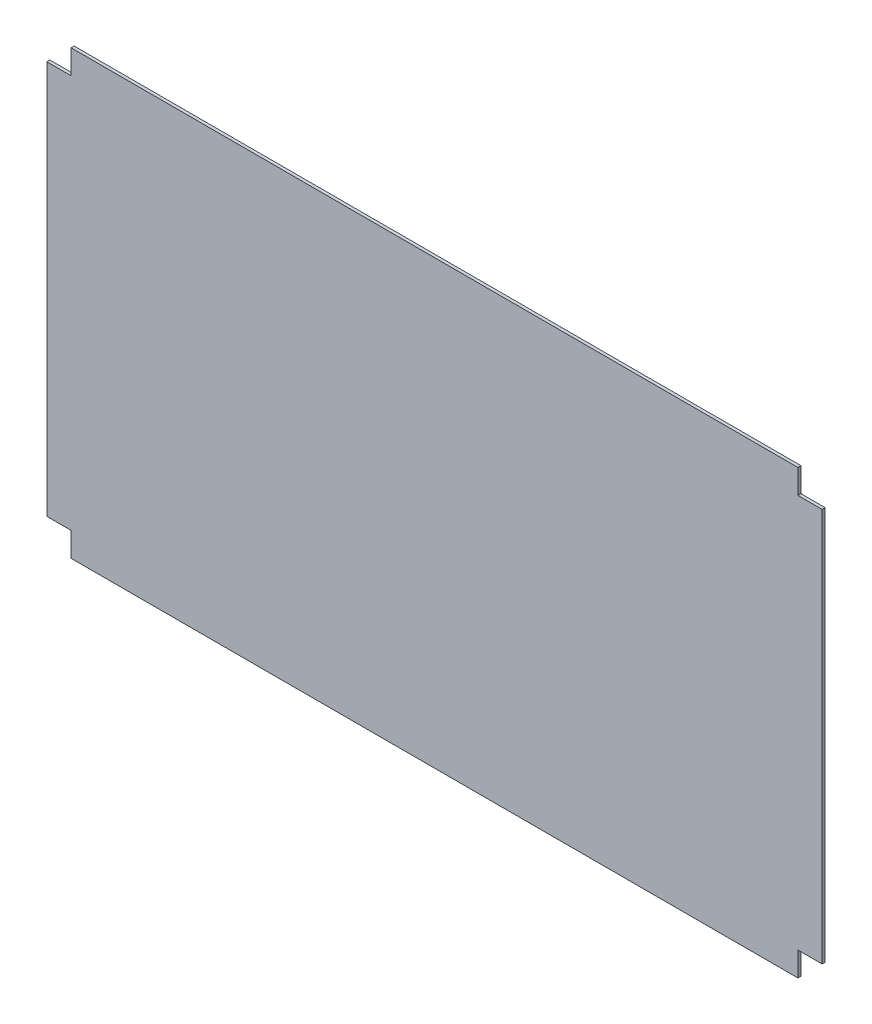
ISO-10303-21;
HEADER;
FILE_DESCRIPTION(('STEP AP214'),'2;1');
FILE_NAME('part.step','',(''),(''),'','','');
FILE_SCHEMA(('AUTOMOTIVE_DESIGN { 1 0 10303 214 1 1 1 1 }'));
ENDSEC;
DATA;
#1=APPLICATION_CONTEXT('core data for automotive mechanical design processes');
#2=APPLICATION_PROTOCOL_DEFINITION('international standard','automotive_design',2000,#1);
#3=PRODUCT_CONTEXT('',#1,'mechanical');
#4=PRODUCT('Part','Part','',(#3));
#5=PRODUCT_RELATED_PRODUCT_CATEGORY('part','',(#4));
#6=PRODUCT_DEFINITION_FORMATION('','',#4);
#7=PRODUCT_DEFINITION_CONTEXT('part definition',#1,'design');
#8=PRODUCT_DEFINITION('design','',#6,#7);
#9=PRODUCT_DEFINITION_SHAPE('','',#8);
#10=(LENGTH_UNIT() NAMED_UNIT(*) SI_UNIT(.MILLI.,.METRE.));
#11=(NAMED_UNIT(*) PLANE_ANGLE_UNIT() SI_UNIT($,.RADIAN.));
#12=(NAMED_UNIT(*) SI_UNIT($,.STERADIAN.) SOLID_ANGLE_UNIT());
#13=UNCERTAINTY_MEASURE_WITH_UNIT(LENGTH_MEASURE(1.E-05),#10,'distance_accuracy_value','');
#14=(GEOMETRIC_REPRESENTATION_CONTEXT(3) GLOBAL_UNCERTAINTY_ASSIGNED_CONTEXT((#13)) GLOBAL_UNIT_ASSIGNED_CONTEXT((#10,
#11,#12)) REPRESENTATION_CONTEXT('',''));
#15=CARTESIAN_POINT('',(0.,0.,0.));
#16=DIRECTION('',(0.,0.,1.));
#17=DIRECTION('',(1.,0.,0.));
#18=AXIS2_PLACEMENT_3D('',#15,#16,#17);
#19=CARTESIAN_POINT('',(40.0000000000001,0.,5.));
#20=DIRECTION('',(-1.,0.,0.));
#21=DIRECTION('',(0.,0.,1.));
#22=AXIS2_PLACEMENT_3D('',#19,#20,#21);
#23=PLANE('',#22);
#24=DIRECTION('',(0.,1.,0.));
#25=VECTOR('',#24,1.);
#26=CARTESIAN_POINT('',(40.0000000000001,0.,0.));
#27=LINE('',#26,#25);
#28=CARTESIAN_POINT('',(40.0000000000001,-730.,0.));
#29=VERTEX_POINT('',#28);
#30=CARTESIAN_POINT('',(40.0000000000001,-690.,0.));
#31=VERTEX_POINT('',#30);
#32=EDGE_CURVE('E154',#29,#31,#27,.T.);
#33=ORIENTED_EDGE('',*,*,#32,.F.);
#34=DIRECTION('',(0.,0.,-1.));
#35=VECTOR('',#34,1.);
#36=CARTESIAN_POINT('',(40.0000000000001,-730.,5.));
#37=LINE('',#36,#35);
#38=CARTESIAN_POINT('',(40.0000000000001,-730.,5.));
#39=VERTEX_POINT('',#38);
#40=EDGE_CURVE('E11',#39,#29,#37,.T.);
#41=ORIENTED_EDGE('',*,*,#40,.F.);
#42=DIRECTION('',(0.,1.,0.));
#43=VECTOR('',#42,1.);
#44=CARTESIAN_POINT('',(40.0000000000001,0.,5.));
#45=LINE('',#44,#43);
#46=CARTESIAN_POINT('',(40.0000000000001,-690.,5.));
#47=VERTEX_POINT('',#46);
#48=EDGE_CURVE('E184',#39,#47,#45,.T.);
#49=ORIENTED_EDGE('',*,*,#48,.T.);
#50=DIRECTION('',(0.,0.,-1.));
#51=VECTOR('',#50,1.);
#52=CARTESIAN_POINT('',(40.0000000000001,-690.,5.));
#53=LINE('',#52,#51);
#54=EDGE_CURVE('E97',#47,#31,#53,.T.);
#55=ORIENTED_EDGE('',*,*,#54,.T.);
#56=EDGE_LOOP('',(#33,#41,#49,#55));
#57=FACE_BOUND('',#56,.T.);
#58=ADVANCED_FACE('F35',(#57),#23,.T.);
#59=CARTESIAN_POINT('',(0.,-730.,5.));
#60=DIRECTION('',(0.,1.,0.));
#61=DIRECTION('',(0.,0.,1.));
#62=AXIS2_PLACEMENT_3D('',#59,#60,#61);
#63=PLANE('',#62);
#64=DIRECTION('',(1.,0.,0.));
#65=VECTOR('',#64,1.);
#66=CARTESIAN_POINT('',(0.,-730.,0.));
#67=LINE('',#66,#65);
#68=CARTESIAN_POINT('',(1240.,-730.,0.));
#69=VERTEX_POINT('',#68);
#70=EDGE_CURVE('E157',#29,#69,#67,.T.);
#71=ORIENTED_EDGE('',*,*,#70,.T.);
#72=DIRECTION('',(0.,0.,-1.));
#73=VECTOR('',#72,1.);
#74=CARTESIAN_POINT('',(1240.,-730.,5.));
#75=LINE('',#74,#73);
#76=CARTESIAN_POINT('',(1240.,-730.,5.));
#77=VERTEX_POINT('',#76);
#78=EDGE_CURVE('E43',#77,#69,#75,.T.);
#79=ORIENTED_EDGE('',*,*,#78,.F.);
#80=DIRECTION('',(1.,0.,0.));
#81=VECTOR('',#80,1.);
#82=CARTESIAN_POINT('',(0.,-730.,5.));
#83=LINE('',#82,#81);
#84=EDGE_CURVE('E225',#39,#77,#83,.T.);
#85=ORIENTED_EDGE('',*,*,#84,.F.);
#86=ORIENTED_EDGE('',*,*,#40,.T.);
#87=EDGE_LOOP('',(#71,#79,#85,#86));
#88=FACE_BOUND('',#87,.T.);
#89=ADVANCED_FACE('F254',(#88),#63,.F.);
#90=CARTESIAN_POINT('',(1240.,0.,5.));
#91=DIRECTION('',(-1.,0.,0.));
#92=DIRECTION('',(0.,0.,1.));
#93=AXIS2_PLACEMENT_3D('',#90,#91,#92);
#94=PLANE('',#93);
#95=DIRECTION('',(0.,1.,0.));
#96=VECTOR('',#95,1.);
#97=CARTESIAN_POINT('',(1240.,0.,0.));
#98=LINE('',#97,#96);
#99=CARTESIAN_POINT('',(1240.,-690.,0.));
#100=VERTEX_POINT('',#99);
#101=EDGE_CURVE('E159',#69,#100,#98,.T.);
#102=ORIENTED_EDGE('',*,*,#101,.T.);
#103=DIRECTION('',(0.,0.,-1.));
#104=VECTOR('',#103,1.);
#105=CARTESIAN_POINT('',(1240.,-690.,5.));
#106=LINE('',#105,#104);
#107=CARTESIAN_POINT('',(1240.,-690.,5.));
#108=VERTEX_POINT('',#107);
#109=EDGE_CURVE('E198',#108,#100,#106,.T.);
#110=ORIENTED_EDGE('',*,*,#109,.F.);
#111=DIRECTION('',(0.,1.,0.));
#112=VECTOR('',#111,1.);
#113=CARTESIAN_POINT('',(1240.,0.,5.));
#114=LINE('',#113,#112);
#115=EDGE_CURVE('E206',#77,#108,#114,.T.);
#116=ORIENTED_EDGE('',*,*,#115,.F.);
#117=ORIENTED_EDGE('',*,*,#78,.T.);
#118=EDGE_LOOP('',(#102,#110,#116,#117));
#119=FACE_BOUND('',#118,.T.);
#120=ADVANCED_FACE('F204',(#119),#94,.F.);
#121=CARTESIAN_POINT('',(0.,-690.,5.));
#122=DIRECTION('',(0.,-1.,0.));
#123=DIRECTION('',(0.,0.,-1.));
#124=AXIS2_PLACEMENT_3D('',#121,#122,#123);
#125=PLANE('',#124);
#126=DIRECTION('',(-1.,0.,0.));
#127=VECTOR('',#126,1.);
#128=CARTESIAN_POINT('',(0.,-690.,0.));
#129=LINE('',#128,#127);
#130=CARTESIAN_POINT('',(1280.,-690.,0.));
#131=VERTEX_POINT('',#130);
#132=EDGE_CURVE('E162',#131,#100,#129,.T.);
#133=ORIENTED_EDGE('',*,*,#132,.F.);
#134=DIRECTION('',(0.,0.,-1.));
#135=VECTOR('',#134,1.);
#136=CARTESIAN_POINT('',(1280.,-690.,5.));
#137=LINE('',#136,#135);
#138=CARTESIAN_POINT('',(1280.,-690.,5.));
#139=VERTEX_POINT('',#138);
#140=EDGE_CURVE('E196',#139,#131,#137,.T.);
#141=ORIENTED_EDGE('',*,*,#140,.F.);
#142=DIRECTION('',(-1.,0.,0.));
#143=VECTOR('',#142,1.);
#144=CARTESIAN_POINT('',(0.,-690.,5.));
#145=LINE('',#144,#143);
#146=EDGE_CURVE('E218',#139,#108,#145,.T.);
#147=ORIENTED_EDGE('',*,*,#146,.T.);
#148=ORIENTED_EDGE('',*,*,#109,.T.);
#149=EDGE_LOOP('',(#133,#141,#147,#148));
#150=FACE_BOUND('',#149,.T.);
#151=ADVANCED_FACE('F215',(#150),#125,.T.);
#152=CARTESIAN_POINT('',(1280.,0.,5.));
#153=DIRECTION('',(1.,0.,0.));
#154=DIRECTION('',(0.,0.,-1.));
#155=AXIS2_PLACEMENT_3D('',#152,#153,#154);
#156=PLANE('',#155);
#157=DIRECTION('',(0.,-1.,0.));
#158=VECTOR('',#157,1.);
#159=CARTESIAN_POINT('',(1280.,0.,0.));
#160=LINE('',#159,#158);
#161=CARTESIAN_POINT('',(1280.,-40.,0.));
#162=VERTEX_POINT('',#161);
#163=EDGE_CURVE('E165',#162,#131,#160,.T.);
#164=ORIENTED_EDGE('',*,*,#163,.F.);
#165=DIRECTION('',(0.,0.,-1.));
#166=VECTOR('',#165,1.);
#167=CARTESIAN_POINT('',(1280.,-40.,5.));
#168=LINE('',#167,#166);
#169=CARTESIAN_POINT('',(1280.,-40.,5.));
#170=VERTEX_POINT('',#169);
#171=EDGE_CURVE('E194',#170,#162,#168,.T.);
#172=ORIENTED_EDGE('',*,*,#171,.F.);
#173=DIRECTION('',(0.,-1.,0.));
#174=VECTOR('',#173,1.);
#175=CARTESIAN_POINT('',(1280.,0.,5.));
#176=LINE('',#175,#174);
#177=EDGE_CURVE('E221',#170,#139,#176,.T.);
#178=ORIENTED_EDGE('',*,*,#177,.T.);
#179=ORIENTED_EDGE('',*,*,#140,.T.);
#180=EDGE_LOOP('',(#164,#172,#178,#179));
#181=FACE_BOUND('',#180,.T.);
#182=ADVANCED_FACE('F322',(#181),#156,.T.);
#183=CARTESIAN_POINT('',(0.,-40.0000000000002,5.));
#184=DIRECTION('',(0.,-1.,0.));
#185=DIRECTION('',(1.,0.,0.));
#186=AXIS2_PLACEMENT_3D('',#183,#184,#185);
#187=PLANE('',#186);
#188=DIRECTION('',(-1.,0.,0.));
#189=VECTOR('',#188,1.);
#190=CARTESIAN_POINT('',(0.,-40.0000000000002,0.));
#191=LINE('',#190,#189);
#192=CARTESIAN_POINT('',(1240.,-40.,0.));
#193=VERTEX_POINT('',#192);
#194=EDGE_CURVE('E168',#162,#193,#191,.T.);
#195=ORIENTED_EDGE('',*,*,#194,.T.);
#196=DIRECTION('',(0.,0.,-1.));
#197=VECTOR('',#196,1.);
#198=CARTESIAN_POINT('',(1240.,-40.,5.));
#199=LINE('',#198,#197);
#200=CARTESIAN_POINT('',(1240.,-40.,5.));
#201=VERTEX_POINT('',#200);
#202=EDGE_CURVE('E192',#201,#193,#199,.T.);
#203=ORIENTED_EDGE('',*,*,#202,.F.);
#204=DIRECTION('',(-1.,0.,0.));
#205=VECTOR('',#204,1.);
#206=CARTESIAN_POINT('',(0.,-40.0000000000002,5.));
#207=LINE('',#206,#205);
#208=EDGE_CURVE('E223',#170,#201,#207,.T.);
#209=ORIENTED_EDGE('',*,*,#208,.F.);
#210=ORIENTED_EDGE('',*,*,#171,.T.);
#211=EDGE_LOOP('',(#195,#203,#209,#210));
#212=FACE_BOUND('',#211,.T.);
#213=ADVANCED_FACE('F313',(#212),#187,.F.);
#214=CARTESIAN_POINT('',(1240.,0.,5.));
#215=DIRECTION('',(1.,0.,0.));
#216=DIRECTION('',(0.,0.,-1.));
#217=AXIS2_PLACEMENT_3D('',#214,#215,#216);
#218=PLANE('',#217);
#219=DIRECTION('',(0.,-1.,0.));
#220=VECTOR('',#219,1.);
#221=CARTESIAN_POINT('',(1240.,0.,0.));
#222=LINE('',#221,#220);
#223=CARTESIAN_POINT('',(1240.,1.3433771062804E-13,0.));
#224=VERTEX_POINT('',#223);
#225=EDGE_CURVE('E171',#224,#193,#222,.T.);
#226=ORIENTED_EDGE('',*,*,#225,.F.);
#227=DIRECTION('',(0.,0.,-1.));
#228=VECTOR('',#227,1.);
#229=CARTESIAN_POINT('',(1240.,1.3433771062804E-13,5.));
#230=LINE('',#229,#228);
#231=CARTESIAN_POINT('',(1240.,1.3433771062804E-13,5.));
#232=VERTEX_POINT('',#231);
#233=EDGE_CURVE('E190',#232,#224,#230,.T.);
#234=ORIENTED_EDGE('',*,*,#233,.F.);
#235=DIRECTION('',(0.,-1.,0.));
#236=VECTOR('',#235,1.);
#237=CARTESIAN_POINT('',(1240.,0.,5.));
#238=LINE('',#237,#236);
#239=EDGE_CURVE('E230',#232,#201,#238,.T.);
#240=ORIENTED_EDGE('',*,*,#239,.T.);
#241=ORIENTED_EDGE('',*,*,#202,.T.);
#242=EDGE_LOOP('',(#226,#234,#240,#241));
#243=FACE_BOUND('',#242,.T.);
#244=ADVANCED_FACE('F241',(#243),#218,.T.);
#245=CARTESIAN_POINT('',(0.,0.,5.));
#246=DIRECTION('',(0.,1.,0.));
#247=DIRECTION('',(-1.,0.,0.));
#248=AXIS2_PLACEMENT_3D('',#245,#246,#247);
#249=PLANE('',#248);
#250=DIRECTION('',(1.,0.,0.));
#251=VECTOR('',#250,1.);
#252=CARTESIAN_POINT('',(0.,0.,0.));
#253=LINE('',#252,#251);
#254=CARTESIAN_POINT('',(40.,0.,0.));
#255=VERTEX_POINT('',#254);
#256=EDGE_CURVE('E174',#255,#224,#253,.T.);
#257=ORIENTED_EDGE('',*,*,#256,.F.);
#258=DIRECTION('',(0.,0.,-1.));
#259=VECTOR('',#258,1.);
#260=CARTESIAN_POINT('',(40.,0.,5.));
#261=LINE('',#260,#259);
#262=CARTESIAN_POINT('',(40.,0.,5.));
#263=VERTEX_POINT('',#262);
#264=EDGE_CURVE('E188',#263,#255,#261,.T.);
#265=ORIENTED_EDGE('',*,*,#264,.F.);
#266=DIRECTION('',(1.,0.,0.));
#267=VECTOR('',#266,1.);
#268=CARTESIAN_POINT('',(0.,0.,5.));
#269=LINE('',#268,#267);
#270=EDGE_CURVE('E149',#263,#232,#269,.T.);
#271=ORIENTED_EDGE('',*,*,#270,.T.);
#272=ORIENTED_EDGE('',*,*,#233,.T.);
#273=EDGE_LOOP('',(#257,#265,#271,#272));
#274=FACE_BOUND('',#273,.T.);
#275=ADVANCED_FACE('F235',(#274),#249,.T.);
#276=CARTESIAN_POINT('',(40.,0.,5.));
#277=DIRECTION('',(1.,0.,0.));
#278=DIRECTION('',(0.,1.,0.));
#279=AXIS2_PLACEMENT_3D('',#276,#277,#278);
#280=PLANE('',#279);
#281=DIRECTION('',(0.,-1.,0.));
#282=VECTOR('',#281,1.);
#283=CARTESIAN_POINT('',(40.,0.,0.));
#284=LINE('',#283,#282);
#285=CARTESIAN_POINT('',(40.,-40.,0.));
#286=VERTEX_POINT('',#285);
#287=EDGE_CURVE('E177',#255,#286,#284,.T.);
#288=ORIENTED_EDGE('',*,*,#287,.T.);
#289=DIRECTION('',(0.,0.,-1.));
#290=VECTOR('',#289,1.);
#291=CARTESIAN_POINT('',(40.,-40.,5.));
#292=LINE('',#291,#290);
#293=CARTESIAN_POINT('',(40.,-40.,5.));
#294=VERTEX_POINT('',#293);
#295=EDGE_CURVE('E137',#294,#286,#292,.T.);
#296=ORIENTED_EDGE('',*,*,#295,.F.);
#297=DIRECTION('',(0.,-1.,0.));
#298=VECTOR('',#297,1.);
#299=CARTESIAN_POINT('',(40.,0.,5.));
#300=LINE('',#299,#298);
#301=EDGE_CURVE('E146',#263,#294,#300,.T.);
#302=ORIENTED_EDGE('',*,*,#301,.F.);
#303=ORIENTED_EDGE('',*,*,#264,.T.);
#304=EDGE_LOOP('',(#288,#296,#302,#303));
#305=FACE_BOUND('',#304,.T.);
#306=ADVANCED_FACE('F244',(#305),#280,.F.);
#307=CARTESIAN_POINT('',(0.,-40.,5.));
#308=DIRECTION('',(0.,1.,0.));
#309=DIRECTION('',(0.,0.,1.));
#310=AXIS2_PLACEMENT_3D('',#307,#308,#309);
#311=PLANE('',#310);
#312=DIRECTION('',(1.,0.,0.));
#313=VECTOR('',#312,1.);
#314=CARTESIAN_POINT('',(0.,-40.,0.));
#315=LINE('',#314,#313);
#316=CARTESIAN_POINT('',(0.,-40.,0.));
#317=VERTEX_POINT('',#316);
#318=EDGE_CURVE('E136',#317,#286,#315,.T.);
#319=ORIENTED_EDGE('',*,*,#318,.F.);
#320=DIRECTION('',(0.,0.,-1.));
#321=VECTOR('',#320,1.);
#322=CARTESIAN_POINT('',(0.,-40.,5.));
#323=LINE('',#322,#321);
#324=CARTESIAN_POINT('',(0.,-40.,5.));
#325=VERTEX_POINT('',#324);
#326=EDGE_CURVE('E130',#325,#317,#323,.T.);
#327=ORIENTED_EDGE('',*,*,#326,.F.);
#328=DIRECTION('',(1.,0.,0.));
#329=VECTOR('',#328,1.);
#330=CARTESIAN_POINT('',(0.,-40.,5.));
#331=LINE('',#330,#329);
#332=EDGE_CURVE('E134',#325,#294,#331,.T.);
#333=ORIENTED_EDGE('',*,*,#332,.T.);
#334=ORIENTED_EDGE('',*,*,#295,.T.);
#335=EDGE_LOOP('',(#319,#327,#333,#334));
#336=FACE_BOUND('',#335,.T.);
#337=ADVANCED_FACE('F132',(#336),#311,.T.);
#338=CARTESIAN_POINT('',(0.,0.,5.));
#339=DIRECTION('',(1.,0.,0.));
#340=DIRECTION('',(0.,1.,0.));
#341=AXIS2_PLACEMENT_3D('',#338,#339,#340);
#342=PLANE('',#341);
#343=DIRECTION('',(0.,-1.,0.));
#344=VECTOR('',#343,1.);
#345=CARTESIAN_POINT('',(0.,0.,0.));
#346=LINE('',#345,#344);
#347=CARTESIAN_POINT('',(0.,-690.,0.));
#348=VERTEX_POINT('',#347);
#349=EDGE_CURVE('E90',#317,#348,#346,.T.);
#350=ORIENTED_EDGE('',*,*,#349,.T.);
#351=DIRECTION('',(0.,0.,-1.));
#352=VECTOR('',#351,1.);
#353=CARTESIAN_POINT('',(0.,-690.,5.));
#354=LINE('',#353,#352);
#355=CARTESIAN_POINT('',(0.,-690.,5.));
#356=VERTEX_POINT('',#355);
#357=EDGE_CURVE('E138',#356,#348,#354,.T.);
#358=ORIENTED_EDGE('',*,*,#357,.F.);
#359=DIRECTION('',(0.,-1.,0.));
#360=VECTOR('',#359,1.);
#361=CARTESIAN_POINT('',(0.,0.,5.));
#362=LINE('',#361,#360);
#363=EDGE_CURVE('E140',#325,#356,#362,.T.);
#364=ORIENTED_EDGE('',*,*,#363,.F.);
#365=ORIENTED_EDGE('',*,*,#326,.T.);
#366=EDGE_LOOP('',(#350,#358,#364,#365));
#367=FACE_BOUND('',#366,.T.);
#368=ADVANCED_FACE('F141',(#367),#342,.F.);
#369=CARTESIAN_POINT('',(0.,-690.,5.));
#370=DIRECTION('',(0.,1.,0.));
#371=DIRECTION('',(0.,0.,1.));
#372=AXIS2_PLACEMENT_3D('',#369,#370,#371);
#373=PLANE('',#372);
#374=DIRECTION('',(1.,0.,0.));
#375=VECTOR('',#374,1.);
#376=CARTESIAN_POINT('',(0.,-690.,0.));
#377=LINE('',#376,#375);
#378=EDGE_CURVE('E182',#348,#31,#377,.T.);
#379=ORIENTED_EDGE('',*,*,#378,.T.);
#380=ORIENTED_EDGE('',*,*,#54,.F.);
#381=DIRECTION('',(1.,0.,0.));
#382=VECTOR('',#381,1.);
#383=CARTESIAN_POINT('',(0.,-690.,5.));
#384=LINE('',#383,#382);
#385=EDGE_CURVE('E51',#356,#47,#384,.T.);
#386=ORIENTED_EDGE('',*,*,#385,.F.);
#387=ORIENTED_EDGE('',*,*,#357,.T.);
#388=EDGE_LOOP('',(#379,#380,#386,#387));
#389=FACE_BOUND('',#388,.T.);
#390=ADVANCED_FACE('F260',(#389),#373,.F.);
#391=CARTESIAN_POINT('',(0.,0.,5.));
#392=DIRECTION('',(0.,0.,1.));
#393=DIRECTION('',(1.,0.,0.));
#394=AXIS2_PLACEMENT_3D('',#391,#392,#393);
#395=PLANE('',#394);
#396=ORIENTED_EDGE('',*,*,#48,.F.);
#397=ORIENTED_EDGE('',*,*,#84,.T.);
#398=ORIENTED_EDGE('',*,*,#115,.T.);
#399=ORIENTED_EDGE('',*,*,#146,.F.);
#400=ORIENTED_EDGE('',*,*,#177,.F.);
#401=ORIENTED_EDGE('',*,*,#208,.T.);
#402=ORIENTED_EDGE('',*,*,#239,.F.);
#403=ORIENTED_EDGE('',*,*,#270,.F.);
#404=ORIENTED_EDGE('',*,*,#301,.T.);
#405=ORIENTED_EDGE('',*,*,#332,.F.);
#406=ORIENTED_EDGE('',*,*,#363,.T.);
#407=ORIENTED_EDGE('',*,*,#385,.T.);
#408=EDGE_LOOP('',(#396,#397,#398,#399,#400,#401,#402,#403,#404,#405,#406,#407));
#409=FACE_BOUND('',#408,.T.);
#410=ADVANCED_FACE('F143',(#409),#395,.T.);
#411=CARTESIAN_POINT('',(0.,0.,0.));
#412=DIRECTION('',(0.,0.,1.));
#413=DIRECTION('',(1.,0.,0.));
#414=AXIS2_PLACEMENT_3D('',#411,#412,#413);
#415=PLANE('',#414);
#416=ORIENTED_EDGE('',*,*,#32,.T.);
#417=ORIENTED_EDGE('',*,*,#378,.F.);
#418=ORIENTED_EDGE('',*,*,#349,.F.);
#419=ORIENTED_EDGE('',*,*,#318,.T.);
#420=ORIENTED_EDGE('',*,*,#287,.F.);
#421=ORIENTED_EDGE('',*,*,#256,.T.);
#422=ORIENTED_EDGE('',*,*,#225,.T.);
#423=ORIENTED_EDGE('',*,*,#194,.F.);
#424=ORIENTED_EDGE('',*,*,#163,.T.);
#425=ORIENTED_EDGE('',*,*,#132,.T.);
#426=ORIENTED_EDGE('',*,*,#101,.F.);
#427=ORIENTED_EDGE('',*,*,#70,.F.);
#428=EDGE_LOOP('',(#416,#417,#418,#419,#420,#421,#422,#423,#424,#425,#426,#427));
#429=FACE_BOUND('',#428,.T.);
#430=ADVANCED_FACE('F210',(#429),#415,.F.);
#431=CLOSED_SHELL('',(#58,#89,#120,#151,#182,#213,#244,#275,#306,#337,#368,#390,#410,#430));
#432=MANIFOLD_SOLID_BREP('B2',#431);
#433=ADVANCED_BREP_SHAPE_REPRESENTATION('',(#18,#432),#14);
#434=SHAPE_DEFINITION_REPRESENTATION(#9,#433);
ENDSEC;
END-ISO-10303-21;
